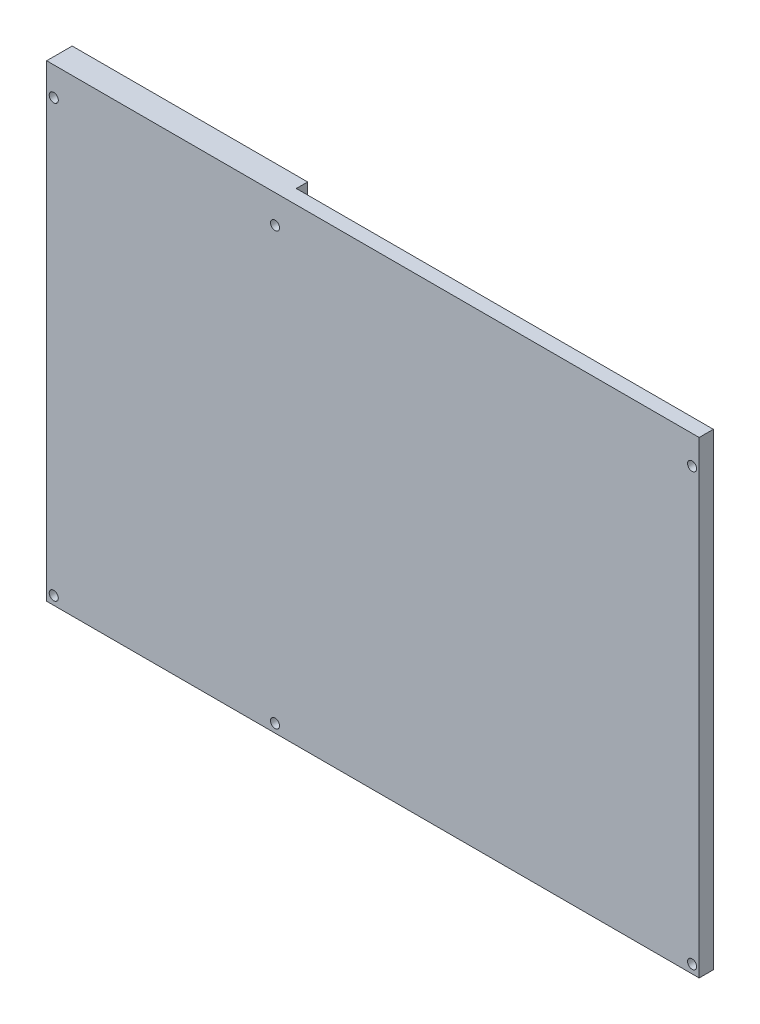
ISO-10303-21;
HEADER;
FILE_DESCRIPTION(('STEP AP214'),'2;1');
FILE_NAME('part.step','',(''),(''),'','','');
FILE_SCHEMA(('AUTOMOTIVE_DESIGN { 1 0 10303 214 1 1 1 1 }'));
ENDSEC;
DATA;
#1=APPLICATION_CONTEXT('core data for automotive mechanical design processes');
#2=APPLICATION_PROTOCOL_DEFINITION('international standard','automotive_design',2000,#1);
#3=PRODUCT_CONTEXT('',#1,'mechanical');
#4=PRODUCT('Part','Part','',(#3));
#5=PRODUCT_RELATED_PRODUCT_CATEGORY('part','',(#4));
#6=PRODUCT_DEFINITION_FORMATION('','',#4);
#7=PRODUCT_DEFINITION_CONTEXT('part definition',#1,'design');
#8=PRODUCT_DEFINITION('design','',#6,#7);
#9=PRODUCT_DEFINITION_SHAPE('','',#8);
#10=(LENGTH_UNIT() NAMED_UNIT(*) SI_UNIT(.MILLI.,.METRE.));
#11=(NAMED_UNIT(*) PLANE_ANGLE_UNIT() SI_UNIT($,.RADIAN.));
#12=(NAMED_UNIT(*) SI_UNIT($,.STERADIAN.) SOLID_ANGLE_UNIT());
#13=UNCERTAINTY_MEASURE_WITH_UNIT(LENGTH_MEASURE(1.E-05),#10,'distance_accuracy_value','');
#14=(GEOMETRIC_REPRESENTATION_CONTEXT(3) GLOBAL_UNCERTAINTY_ASSIGNED_CONTEXT((#13)) GLOBAL_UNIT_ASSIGNED_CONTEXT((#10,
#11,#12)) REPRESENTATION_CONTEXT('',''));
#15=CARTESIAN_POINT('',(0.,0.,0.));
#16=DIRECTION('',(0.,0.,1.));
#17=DIRECTION('',(1.,0.,0.));
#18=AXIS2_PLACEMENT_3D('',#15,#16,#17);
#19=CARTESIAN_POINT('',(0.,165.,0.));
#20=DIRECTION('',(1.,0.,0.));
#21=DIRECTION('',(0.,0.,-1.));
#22=AXIS2_PLACEMENT_3D('',#19,#20,#21);
#23=PLANE('',#22);
#24=DIRECTION('',(0.,0.,1.));
#25=VECTOR('',#24,1.);
#26=CARTESIAN_POINT('',(0.,0.,0.));
#27=LINE('',#26,#25);
#28=CARTESIAN_POINT('',(0.,0.,0.));
#29=VERTEX_POINT('',#28);
#30=CARTESIAN_POINT('',(0.,0.,9.));
#31=VERTEX_POINT('',#30);
#32=EDGE_CURVE('E136',#29,#31,#27,.T.);
#33=ORIENTED_EDGE('',*,*,#32,.T.);
#34=DIRECTION('',(0.,-1.,0.));
#35=VECTOR('',#34,1.);
#36=CARTESIAN_POINT('',(0.,165.,9.));
#37=LINE('',#36,#35);
#38=CARTESIAN_POINT('',(0.,165.,9.));
#39=VERTEX_POINT('',#38);
#40=EDGE_CURVE('E11',#39,#31,#37,.T.);
#41=ORIENTED_EDGE('',*,*,#40,.F.);
#42=DIRECTION('',(0.,0.,1.));
#43=VECTOR('',#42,1.);
#44=CARTESIAN_POINT('',(0.,165.,0.));
#45=LINE('',#44,#43);
#46=CARTESIAN_POINT('',(0.,165.,0.));
#47=VERTEX_POINT('',#46);
#48=EDGE_CURVE('E152',#47,#39,#45,.T.);
#49=ORIENTED_EDGE('',*,*,#48,.F.);
#50=DIRECTION('',(0.,-1.,0.));
#51=VECTOR('',#50,1.);
#52=CARTESIAN_POINT('',(0.,165.,0.));
#53=LINE('',#52,#51);
#54=EDGE_CURVE('E132',#47,#29,#53,.T.);
#55=ORIENTED_EDGE('',*,*,#54,.T.);
#56=EDGE_LOOP('',(#33,#41,#49,#55));
#57=FACE_BOUND('',#56,.T.);
#58=ADVANCED_FACE('F45',(#57),#23,.F.);
#59=CARTESIAN_POINT('',(83.,165.,9.));
#60=DIRECTION('',(0.,0.,-1.));
#61=DIRECTION('',(-1.,0.,0.));
#62=AXIS2_PLACEMENT_3D('',#59,#60,#61);
#63=PLANE('',#62);
#64=CARTESIAN_POINT('',(2.49999999999881,154.999999999999,9.));
#65=DIRECTION('',(0.,0.,1.));
#66=DIRECTION('',(1.,0.,0.));
#67=AXIS2_PLACEMENT_3D('',#64,#65,#66);
#68=CIRCLE('',#67,1.59999999999999);
#69=CARTESIAN_POINT('',(4.0999999999988,154.999999999999,9.));
#70=VERTEX_POINT('',#69);
#71=EDGE_CURVE('E274',#70,#70,#68,.T.);
#72=ORIENTED_EDGE('',*,*,#71,.F.);
#73=EDGE_LOOP('',(#72));
#74=FACE_BOUND('',#73,.T.);
#75=CARTESIAN_POINT('',(80.5000000000004,2.99999999999991,9.));
#76=DIRECTION('',(0.,0.,1.));
#77=DIRECTION('',(1.,0.,0.));
#78=AXIS2_PLACEMENT_3D('',#75,#76,#77);
#79=CIRCLE('',#78,1.60000000000001);
#80=CARTESIAN_POINT('',(82.1000000000004,2.99999999999991,9.));
#81=VERTEX_POINT('',#80);
#82=EDGE_CURVE('E268',#81,#81,#79,.T.);
#83=ORIENTED_EDGE('',*,*,#82,.F.);
#84=EDGE_LOOP('',(#83));
#85=FACE_BOUND('',#84,.T.);
#86=CARTESIAN_POINT('',(80.4999999999988,155.,9.));
#87=DIRECTION('',(0.,0.,1.));
#88=DIRECTION('',(1.,0.,0.));
#89=AXIS2_PLACEMENT_3D('',#86,#87,#88);
#90=CIRCLE('',#89,1.59999999999999);
#91=CARTESIAN_POINT('',(82.0999999999988,155.,9.));
#92=VERTEX_POINT('',#91);
#93=EDGE_CURVE('E177',#92,#92,#90,.T.);
#94=ORIENTED_EDGE('',*,*,#93,.F.);
#95=EDGE_LOOP('',(#94));
#96=FACE_BOUND('',#95,.T.);
#97=CARTESIAN_POINT('',(227.499999999999,155.000000000001,9.));
#98=DIRECTION('',(0.,0.,1.));
#99=DIRECTION('',(1.,0.,0.));
#100=AXIS2_PLACEMENT_3D('',#97,#98,#99);
#101=CIRCLE('',#100,1.59999999999999);
#102=CARTESIAN_POINT('',(229.099999999999,155.000000000001,9.));
#103=VERTEX_POINT('',#102);
#104=EDGE_CURVE('E171',#103,#103,#101,.T.);
#105=ORIENTED_EDGE('',*,*,#104,.F.);
#106=EDGE_LOOP('',(#105));
#107=FACE_BOUND('',#106,.T.);
#108=CARTESIAN_POINT('',(2.50000000000039,2.9999999999991,9.));
#109=DIRECTION('',(0.,0.,1.));
#110=DIRECTION('',(1.,0.,0.));
#111=AXIS2_PLACEMENT_3D('',#108,#109,#110);
#112=CIRCLE('',#111,1.59999999999999);
#113=CARTESIAN_POINT('',(4.10000000000038,2.9999999999991,9.));
#114=VERTEX_POINT('',#113);
#115=EDGE_CURVE('E285',#114,#114,#112,.T.);
#116=ORIENTED_EDGE('',*,*,#115,.F.);
#117=EDGE_LOOP('',(#116));
#118=FACE_BOUND('',#117,.T.);
#119=CARTESIAN_POINT('',(227.5,3.0000000000014,9.));
#120=DIRECTION('',(0.,0.,1.));
#121=DIRECTION('',(1.,0.,0.));
#122=AXIS2_PLACEMENT_3D('',#119,#120,#121);
#123=CIRCLE('',#122,1.60000000000002);
#124=CARTESIAN_POINT('',(229.1,3.0000000000014,9.));
#125=VERTEX_POINT('',#124);
#126=EDGE_CURVE('E164',#125,#125,#123,.T.);
#127=ORIENTED_EDGE('',*,*,#126,.F.);
#128=EDGE_LOOP('',(#127));
#129=FACE_BOUND('',#128,.T.);
#130=DIRECTION('',(1.,0.,0.));
#131=VECTOR('',#130,1.);
#132=CARTESIAN_POINT('',(83.,0.,9.));
#133=LINE('',#132,#131);
#134=CARTESIAN_POINT('',(230.,0.,9.));
#135=VERTEX_POINT('',#134);
#136=EDGE_CURVE('E140',#31,#135,#133,.T.);
#137=ORIENTED_EDGE('',*,*,#136,.T.);
#138=DIRECTION('',(0.,-1.,0.));
#139=VECTOR('',#138,1.);
#140=CARTESIAN_POINT('',(230.,165.,9.));
#141=LINE('',#140,#139);
#142=CARTESIAN_POINT('',(230.,165.,9.));
#143=VERTEX_POINT('',#142);
#144=EDGE_CURVE('E55',#143,#135,#141,.T.);
#145=ORIENTED_EDGE('',*,*,#144,.F.);
#146=DIRECTION('',(1.,0.,0.));
#147=VECTOR('',#146,1.);
#148=CARTESIAN_POINT('',(0.,165.,9.));
#149=LINE('',#148,#147);
#150=EDGE_CURVE('E101',#39,#143,#149,.T.);
#151=ORIENTED_EDGE('',*,*,#150,.F.);
#152=ORIENTED_EDGE('',*,*,#40,.T.);
#153=EDGE_LOOP('',(#137,#145,#151,#152));
#154=FACE_BOUND('',#153,.T.);
#155=ADVANCED_FACE('F189',(#74,#85,#96,#107,#118,#129,#154),#63,.F.);
#156=CARTESIAN_POINT('',(230.,165.,4.));
#157=DIRECTION('',(-1.,0.,0.));
#158=DIRECTION('',(0.,0.,1.));
#159=AXIS2_PLACEMENT_3D('',#156,#157,#158);
#160=PLANE('',#159);
#161=DIRECTION('',(0.,0.,-1.));
#162=VECTOR('',#161,1.);
#163=CARTESIAN_POINT('',(230.,0.,4.));
#164=LINE('',#163,#162);
#165=CARTESIAN_POINT('',(230.,0.,4.));
#166=VERTEX_POINT('',#165);
#167=EDGE_CURVE('E143',#135,#166,#164,.T.);
#168=ORIENTED_EDGE('',*,*,#167,.T.);
#169=DIRECTION('',(0.,-1.,0.));
#170=VECTOR('',#169,1.);
#171=CARTESIAN_POINT('',(230.,165.,4.));
#172=LINE('',#171,#170);
#173=CARTESIAN_POINT('',(230.,165.,4.));
#174=VERTEX_POINT('',#173);
#175=EDGE_CURVE('E125',#174,#166,#172,.T.);
#176=ORIENTED_EDGE('',*,*,#175,.F.);
#177=DIRECTION('',(0.,0.,-1.));
#178=VECTOR('',#177,1.);
#179=CARTESIAN_POINT('',(230.,165.,4.));
#180=LINE('',#179,#178);
#181=EDGE_CURVE('E114',#143,#174,#180,.T.);
#182=ORIENTED_EDGE('',*,*,#181,.F.);
#183=ORIENTED_EDGE('',*,*,#144,.T.);
#184=EDGE_LOOP('',(#168,#176,#182,#183));
#185=FACE_BOUND('',#184,.T.);
#186=ADVANCED_FACE('F192',(#185),#160,.F.);
#187=CARTESIAN_POINT('',(83.,165.,4.));
#188=DIRECTION('',(0.,0.,1.));
#189=DIRECTION('',(1.,0.,0.));
#190=AXIS2_PLACEMENT_3D('',#187,#188,#189);
#191=PLANE('',#190);
#192=CARTESIAN_POINT('',(227.499999999999,155.000000000001,4.));
#193=DIRECTION('',(0.,0.,1.));
#194=DIRECTION('',(1.,0.,0.));
#195=AXIS2_PLACEMENT_3D('',#192,#193,#194);
#196=CIRCLE('',#195,1.59999999999999);
#197=CARTESIAN_POINT('',(229.099999999999,155.000000000001,4.));
#198=VERTEX_POINT('',#197);
#199=EDGE_CURVE('E48',#198,#198,#196,.T.);
#200=ORIENTED_EDGE('',*,*,#199,.T.);
#201=EDGE_LOOP('',(#200));
#202=FACE_BOUND('',#201,.T.);
#203=CARTESIAN_POINT('',(227.5,3.0000000000014,4.));
#204=DIRECTION('',(0.,0.,1.));
#205=DIRECTION('',(1.,0.,0.));
#206=AXIS2_PLACEMENT_3D('',#203,#204,#205);
#207=CIRCLE('',#206,1.60000000000002);
#208=CARTESIAN_POINT('',(229.1,3.0000000000014,4.));
#209=VERTEX_POINT('',#208);
#210=EDGE_CURVE('E161',#209,#209,#207,.T.);
#211=ORIENTED_EDGE('',*,*,#210,.T.);
#212=EDGE_LOOP('',(#211));
#213=FACE_BOUND('',#212,.T.);
#214=DIRECTION('',(-1.,0.,0.));
#215=VECTOR('',#214,1.);
#216=CARTESIAN_POINT('',(83.,0.,4.));
#217=LINE('',#216,#215);
#218=CARTESIAN_POINT('',(83.,0.,4.));
#219=VERTEX_POINT('',#218);
#220=EDGE_CURVE('E123',#166,#219,#217,.T.);
#221=ORIENTED_EDGE('',*,*,#220,.T.);
#222=DIRECTION('',(0.,-1.,0.));
#223=VECTOR('',#222,1.);
#224=CARTESIAN_POINT('',(83.,165.,4.));
#225=LINE('',#224,#223);
#226=CARTESIAN_POINT('',(83.,165.,4.));
#227=VERTEX_POINT('',#226);
#228=EDGE_CURVE('E120',#227,#219,#225,.T.);
#229=ORIENTED_EDGE('',*,*,#228,.F.);
#230=DIRECTION('',(-1.,0.,0.));
#231=VECTOR('',#230,1.);
#232=CARTESIAN_POINT('',(83.,165.,4.));
#233=LINE('',#232,#231);
#234=EDGE_CURVE('E108',#174,#227,#233,.T.);
#235=ORIENTED_EDGE('',*,*,#234,.F.);
#236=ORIENTED_EDGE('',*,*,#175,.T.);
#237=EDGE_LOOP('',(#221,#229,#235,#236));
#238=FACE_BOUND('',#237,.T.);
#239=ADVANCED_FACE('F121',(#202,#213,#238),#191,.F.);
#240=CARTESIAN_POINT('',(83.,165.,0.));
#241=DIRECTION('',(-1.,0.,0.));
#242=DIRECTION('',(0.,0.,1.));
#243=AXIS2_PLACEMENT_3D('',#240,#241,#242);
#244=PLANE('',#243);
#245=DIRECTION('',(0.,0.,-1.));
#246=VECTOR('',#245,1.);
#247=CARTESIAN_POINT('',(83.,0.,0.));
#248=LINE('',#247,#246);
#249=CARTESIAN_POINT('',(83.,0.,0.));
#250=VERTEX_POINT('',#249);
#251=EDGE_CURVE('E87',#219,#250,#248,.T.);
#252=ORIENTED_EDGE('',*,*,#251,.T.);
#253=DIRECTION('',(0.,-1.,0.));
#254=VECTOR('',#253,1.);
#255=CARTESIAN_POINT('',(83.,165.,0.));
#256=LINE('',#255,#254);
#257=CARTESIAN_POINT('',(83.,165.,0.));
#258=VERTEX_POINT('',#257);
#259=EDGE_CURVE('E126',#258,#250,#256,.T.);
#260=ORIENTED_EDGE('',*,*,#259,.F.);
#261=DIRECTION('',(0.,0.,-1.));
#262=VECTOR('',#261,1.);
#263=CARTESIAN_POINT('',(83.,165.,0.));
#264=LINE('',#263,#262);
#265=EDGE_CURVE('E112',#227,#258,#264,.T.);
#266=ORIENTED_EDGE('',*,*,#265,.F.);
#267=ORIENTED_EDGE('',*,*,#228,.T.);
#268=EDGE_LOOP('',(#252,#260,#266,#267));
#269=FACE_BOUND('',#268,.T.);
#270=ADVANCED_FACE('F128',(#269),#244,.F.);
#271=CARTESIAN_POINT('',(0.,165.,0.));
#272=DIRECTION('',(0.,0.,1.));
#273=DIRECTION('',(1.,0.,0.));
#274=AXIS2_PLACEMENT_3D('',#271,#272,#273);
#275=PLANE('',#274);
#276=CARTESIAN_POINT('',(2.49999999999881,154.999999999999,0.));
#277=DIRECTION('',(0.,0.,1.));
#278=DIRECTION('',(1.,0.,0.));
#279=AXIS2_PLACEMENT_3D('',#276,#277,#278);
#280=CIRCLE('',#279,1.59999999999999);
#281=CARTESIAN_POINT('',(4.0999999999988,154.999999999999,0.));
#282=VERTEX_POINT('',#281);
#283=EDGE_CURVE('E283',#282,#282,#280,.T.);
#284=ORIENTED_EDGE('',*,*,#283,.T.);
#285=EDGE_LOOP('',(#284));
#286=FACE_BOUND('',#285,.T.);
#287=CARTESIAN_POINT('',(80.5000000000004,2.99999999999991,0.));
#288=DIRECTION('',(0.,0.,1.));
#289=DIRECTION('',(1.,0.,0.));
#290=AXIS2_PLACEMENT_3D('',#287,#288,#289);
#291=CIRCLE('',#290,1.60000000000001);
#292=CARTESIAN_POINT('',(82.1000000000004,2.99999999999991,0.));
#293=VERTEX_POINT('',#292);
#294=EDGE_CURVE('E265',#293,#293,#291,.T.);
#295=ORIENTED_EDGE('',*,*,#294,.T.);
#296=EDGE_LOOP('',(#295));
#297=FACE_BOUND('',#296,.T.);
#298=CARTESIAN_POINT('',(80.4999999999988,155.,0.));
#299=DIRECTION('',(0.,0.,1.));
#300=DIRECTION('',(1.,0.,0.));
#301=AXIS2_PLACEMENT_3D('',#298,#299,#300);
#302=CIRCLE('',#301,1.59999999999999);
#303=CARTESIAN_POINT('',(82.0999999999988,155.,0.));
#304=VERTEX_POINT('',#303);
#305=EDGE_CURVE('E181',#304,#304,#302,.T.);
#306=ORIENTED_EDGE('',*,*,#305,.T.);
#307=EDGE_LOOP('',(#306));
#308=FACE_BOUND('',#307,.T.);
#309=CARTESIAN_POINT('',(2.50000000000039,2.9999999999991,0.));
#310=DIRECTION('',(0.,0.,1.));
#311=DIRECTION('',(1.,0.,0.));
#312=AXIS2_PLACEMENT_3D('',#309,#310,#311);
#313=CIRCLE('',#312,1.59999999999999);
#314=CARTESIAN_POINT('',(4.10000000000038,2.9999999999991,0.));
#315=VERTEX_POINT('',#314);
#316=EDGE_CURVE('E277',#315,#315,#313,.T.);
#317=ORIENTED_EDGE('',*,*,#316,.T.);
#318=EDGE_LOOP('',(#317));
#319=FACE_BOUND('',#318,.T.);
#320=DIRECTION('',(-1.,0.,0.));
#321=VECTOR('',#320,1.);
#322=CARTESIAN_POINT('',(0.,0.,0.));
#323=LINE('',#322,#321);
#324=EDGE_CURVE('E93',#250,#29,#323,.T.);
#325=ORIENTED_EDGE('',*,*,#324,.T.);
#326=ORIENTED_EDGE('',*,*,#54,.F.);
#327=DIRECTION('',(-1.,0.,0.));
#328=VECTOR('',#327,1.);
#329=CARTESIAN_POINT('',(0.,165.,0.));
#330=LINE('',#329,#328);
#331=EDGE_CURVE('E64',#258,#47,#330,.T.);
#332=ORIENTED_EDGE('',*,*,#331,.F.);
#333=ORIENTED_EDGE('',*,*,#259,.T.);
#334=EDGE_LOOP('',(#325,#326,#332,#333));
#335=FACE_BOUND('',#334,.T.);
#336=ADVANCED_FACE('F197',(#286,#297,#308,#319,#335),#275,.F.);
#337=CARTESIAN_POINT('',(0.,165.,0.));
#338=DIRECTION('',(0.,1.,0.));
#339=DIRECTION('',(0.,0.,1.));
#340=AXIS2_PLACEMENT_3D('',#337,#338,#339);
#341=PLANE('',#340);
#342=ORIENTED_EDGE('',*,*,#48,.T.);
#343=ORIENTED_EDGE('',*,*,#150,.T.);
#344=ORIENTED_EDGE('',*,*,#181,.T.);
#345=ORIENTED_EDGE('',*,*,#234,.T.);
#346=ORIENTED_EDGE('',*,*,#265,.T.);
#347=ORIENTED_EDGE('',*,*,#331,.T.);
#348=EDGE_LOOP('',(#342,#343,#344,#345,#346,#347));
#349=FACE_BOUND('',#348,.T.);
#350=ADVANCED_FACE('F110',(#349),#341,.T.);
#351=CARTESIAN_POINT('',(0.,0.,0.));
#352=DIRECTION('',(0.,1.,0.));
#353=DIRECTION('',(0.,0.,1.));
#354=AXIS2_PLACEMENT_3D('',#351,#352,#353);
#355=PLANE('',#354);
#356=ORIENTED_EDGE('',*,*,#32,.F.);
#357=ORIENTED_EDGE('',*,*,#324,.F.);
#358=ORIENTED_EDGE('',*,*,#251,.F.);
#359=ORIENTED_EDGE('',*,*,#220,.F.);
#360=ORIENTED_EDGE('',*,*,#167,.F.);
#361=ORIENTED_EDGE('',*,*,#136,.F.);
#362=EDGE_LOOP('',(#356,#357,#358,#359,#360,#361));
#363=FACE_BOUND('',#362,.T.);
#364=ADVANCED_FACE('F195',(#363),#355,.F.);
#365=CARTESIAN_POINT('',(2.50000000000039,2.9999999999991,0.));
#366=DIRECTION('',(0.,0.,1.));
#367=DIRECTION('',(1.,0.,0.));
#368=AXIS2_PLACEMENT_3D('',#365,#366,#367);
#369=CYLINDRICAL_SURFACE('',#368,1.59999999999999);
#370=ORIENTED_EDGE('',*,*,#316,.F.);
#371=EDGE_LOOP('',(#370));
#372=FACE_BOUND('',#371,.T.);
#373=ORIENTED_EDGE('',*,*,#115,.T.);
#374=EDGE_LOOP('',(#373));
#375=FACE_BOUND('',#374,.T.);
#376=ADVANCED_FACE('F246',(#372,#375),#369,.F.);
#377=CARTESIAN_POINT('',(80.4999999999988,155.,0.));
#378=DIRECTION('',(0.,0.,1.));
#379=DIRECTION('',(1.,0.,0.));
#380=AXIS2_PLACEMENT_3D('',#377,#378,#379);
#381=CYLINDRICAL_SURFACE('',#380,1.59999999999999);
#382=ORIENTED_EDGE('',*,*,#305,.F.);
#383=EDGE_LOOP('',(#382));
#384=FACE_BOUND('',#383,.T.);
#385=ORIENTED_EDGE('',*,*,#93,.T.);
#386=EDGE_LOOP('',(#385));
#387=FACE_BOUND('',#386,.T.);
#388=ADVANCED_FACE('F243',(#384,#387),#381,.F.);
#389=CARTESIAN_POINT('',(80.5000000000004,2.99999999999991,0.));
#390=DIRECTION('',(0.,0.,1.));
#391=DIRECTION('',(1.,0.,0.));
#392=AXIS2_PLACEMENT_3D('',#389,#390,#391);
#393=CYLINDRICAL_SURFACE('',#392,1.60000000000001);
#394=ORIENTED_EDGE('',*,*,#294,.F.);
#395=EDGE_LOOP('',(#394));
#396=FACE_BOUND('',#395,.T.);
#397=ORIENTED_EDGE('',*,*,#82,.T.);
#398=EDGE_LOOP('',(#397));
#399=FACE_BOUND('',#398,.T.);
#400=ADVANCED_FACE('F245',(#396,#399),#393,.F.);
#401=CARTESIAN_POINT('',(2.49999999999881,154.999999999999,0.));
#402=DIRECTION('',(0.,0.,1.));
#403=DIRECTION('',(1.,0.,0.));
#404=AXIS2_PLACEMENT_3D('',#401,#402,#403);
#405=CYLINDRICAL_SURFACE('',#404,1.59999999999999);
#406=ORIENTED_EDGE('',*,*,#283,.F.);
#407=EDGE_LOOP('',(#406));
#408=FACE_BOUND('',#407,.T.);
#409=ORIENTED_EDGE('',*,*,#71,.T.);
#410=EDGE_LOOP('',(#409));
#411=FACE_BOUND('',#410,.T.);
#412=ADVANCED_FACE('F238',(#408,#411),#405,.F.);
#413=CARTESIAN_POINT('',(227.5,3.0000000000014,0.));
#414=DIRECTION('',(0.,0.,1.));
#415=DIRECTION('',(1.,0.,0.));
#416=AXIS2_PLACEMENT_3D('',#413,#414,#415);
#417=CYLINDRICAL_SURFACE('',#416,1.60000000000002);
#418=ORIENTED_EDGE('',*,*,#126,.T.);
#419=EDGE_LOOP('',(#418));
#420=FACE_BOUND('',#419,.T.);
#421=ORIENTED_EDGE('',*,*,#210,.F.);
#422=EDGE_LOOP('',(#421));
#423=FACE_BOUND('',#422,.T.);
#424=ADVANCED_FACE('F232',(#420,#423),#417,.F.);
#425=CARTESIAN_POINT('',(227.499999999999,155.000000000001,0.));
#426=DIRECTION('',(0.,0.,1.));
#427=DIRECTION('',(1.,0.,0.));
#428=AXIS2_PLACEMENT_3D('',#425,#426,#427);
#429=CYLINDRICAL_SURFACE('',#428,1.59999999999999);
#430=ORIENTED_EDGE('',*,*,#104,.T.);
#431=EDGE_LOOP('',(#430));
#432=FACE_BOUND('',#431,.T.);
#433=ORIENTED_EDGE('',*,*,#199,.F.);
#434=EDGE_LOOP('',(#433));
#435=FACE_BOUND('',#434,.T.);
#436=ADVANCED_FACE('F230',(#432,#435),#429,.F.);
#437=CLOSED_SHELL('',(#58,#155,#186,#239,#270,#336,#350,#364,#376,#388,#400,#412,#424,#436));
#438=MANIFOLD_SOLID_BREP('B2',#437);
#439=ADVANCED_BREP_SHAPE_REPRESENTATION('',(#18,#438),#14);
#440=SHAPE_DEFINITION_REPRESENTATION(#9,#439);
ENDSEC;
END-ISO-10303-21;
